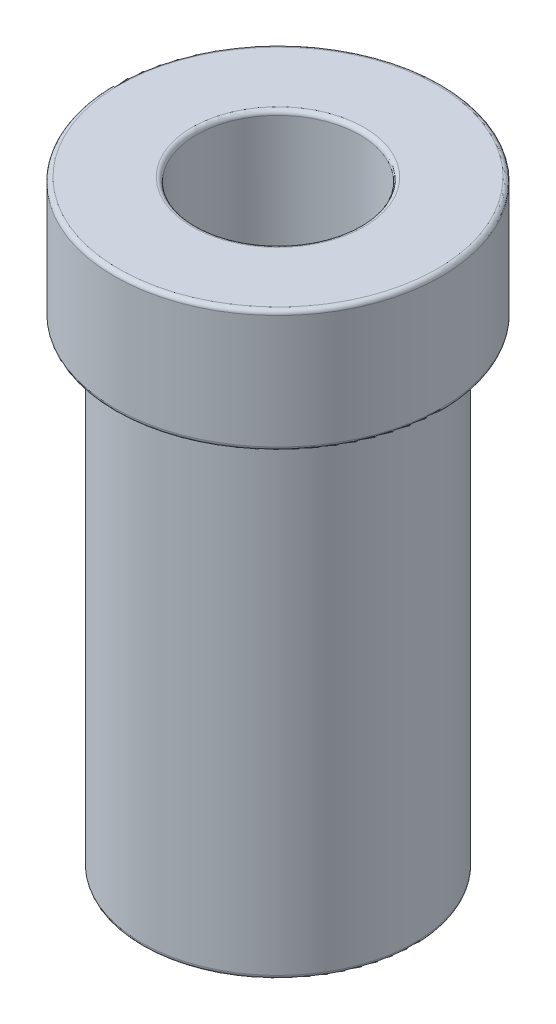
ISO-10303-21;
HEADER;
FILE_DESCRIPTION(('STEP AP214'),'2;1');
FILE_NAME('part.step','',(''),(''),'','','');
FILE_SCHEMA(('AUTOMOTIVE_DESIGN { 1 0 10303 214 1 1 1 1 }'));
ENDSEC;
DATA;
#1=APPLICATION_CONTEXT('core data for automotive mechanical design processes');
#2=APPLICATION_PROTOCOL_DEFINITION('international standard','automotive_design',2000,#1);
#3=PRODUCT_CONTEXT('',#1,'mechanical');
#4=PRODUCT('Part','Part','',(#3));
#5=PRODUCT_RELATED_PRODUCT_CATEGORY('part','',(#4));
#6=PRODUCT_DEFINITION_FORMATION('','',#4);
#7=PRODUCT_DEFINITION_CONTEXT('part definition',#1,'design');
#8=PRODUCT_DEFINITION('design','',#6,#7);
#9=PRODUCT_DEFINITION_SHAPE('','',#8);
#10=(LENGTH_UNIT() NAMED_UNIT(*) SI_UNIT(.MILLI.,.METRE.));
#11=(NAMED_UNIT(*) PLANE_ANGLE_UNIT() SI_UNIT($,.RADIAN.));
#12=(NAMED_UNIT(*) SI_UNIT($,.STERADIAN.) SOLID_ANGLE_UNIT());
#13=UNCERTAINTY_MEASURE_WITH_UNIT(LENGTH_MEASURE(1.E-05),#10,'distance_accuracy_value','');
#14=(GEOMETRIC_REPRESENTATION_CONTEXT(3) GLOBAL_UNCERTAINTY_ASSIGNED_CONTEXT((#13)) GLOBAL_UNIT_ASSIGNED_CONTEXT((#10,
#11,#12)) REPRESENTATION_CONTEXT('',''));
#15=CARTESIAN_POINT('',(0.,0.,0.));
#16=DIRECTION('',(0.,0.,1.));
#17=DIRECTION('',(1.,0.,0.));
#18=AXIS2_PLACEMENT_3D('',#15,#16,#17);
#19=CARTESIAN_POINT('',(0.,-0.6875,0.));
#20=DIRECTION('',(0.,1.,0.));
#21=DIRECTION('',(0.,0.,1.));
#22=AXIS2_PLACEMENT_3D('',#19,#20,#21);
#23=PLANE('',#22);
#24=CARTESIAN_POINT('',(0.,-0.6875,0.));
#25=DIRECTION('',(0.,1.,0.));
#26=DIRECTION('',(0.,0.,1.));
#27=AXIS2_PLACEMENT_3D('',#24,#25,#26);
#28=CIRCLE('',#27,0.15125);
#29=CARTESIAN_POINT('',(0.,-0.6875,0.15125));
#30=VERTEX_POINT('',#29);
#31=EDGE_CURVE('E61',#30,#30,#28,.F.);
#32=ORIENTED_EDGE('',*,*,#31,.T.);
#33=EDGE_LOOP('',(#32));
#34=FACE_BOUND('',#33,.T.);
#35=CARTESIAN_POINT('',(0.,-0.6875,0.));
#36=DIRECTION('',(0.,1.,0.));
#37=DIRECTION('',(0.,0.,1.));
#38=AXIS2_PLACEMENT_3D('',#35,#36,#37);
#39=CIRCLE('',#38,0.09375);
#40=CARTESIAN_POINT('',(0.,-0.6875,0.09375));
#41=VERTEX_POINT('',#40);
#42=EDGE_CURVE('E85',#41,#41,#39,.T.);
#43=ORIENTED_EDGE('',*,*,#42,.T.);
#44=EDGE_LOOP('',(#43));
#45=FACE_BOUND('',#44,.T.);
#46=ADVANCED_FACE('F37',(#34,#45),#23,.F.);
#47=CARTESIAN_POINT('',(0.,0.,0.));
#48=DIRECTION('',(0.,1.,0.));
#49=DIRECTION('',(0.,0.,1.));
#50=AXIS2_PLACEMENT_3D('',#47,#48,#49);
#51=CYLINDRICAL_SURFACE('',#50,0.15625);
#52=CARTESIAN_POINT('',(0.,-0.6825,0.));
#53=DIRECTION('',(0.,1.,0.));
#54=DIRECTION('',(0.,0.,1.));
#55=AXIS2_PLACEMENT_3D('',#52,#53,#54);
#56=CIRCLE('',#55,0.15625);
#57=CARTESIAN_POINT('',(0.,-0.6825,0.15625));
#58=VERTEX_POINT('',#57);
#59=EDGE_CURVE('E65',#58,#58,#56,.T.);
#60=ORIENTED_EDGE('',*,*,#59,.T.);
#61=EDGE_LOOP('',(#60));
#62=FACE_BOUND('',#61,.T.);
#63=CARTESIAN_POINT('',(0.,-0.145625,0.));
#64=DIRECTION('',(0.,1.,0.));
#65=DIRECTION('',(0.,0.,1.));
#66=AXIS2_PLACEMENT_3D('',#63,#64,#65);
#67=CIRCLE('',#66,0.15625);
#68=CARTESIAN_POINT('',(0.,-0.145625,0.15625));
#69=VERTEX_POINT('',#68);
#70=EDGE_CURVE('E69',#69,#69,#67,.F.);
#71=ORIENTED_EDGE('',*,*,#70,.T.);
#72=EDGE_LOOP('',(#71));
#73=FACE_BOUND('',#72,.T.);
#74=ADVANCED_FACE('F108',(#62,#73),#51,.T.);
#75=CARTESIAN_POINT('',(0.15625,-0.140625,0.));
#76=DIRECTION('',(0.,1.,0.));
#77=DIRECTION('',(0.,0.,1.));
#78=AXIS2_PLACEMENT_3D('',#75,#76,#77);
#79=PLANE('',#78);
#80=CARTESIAN_POINT('',(0.,-0.140625,0.));
#81=DIRECTION('',(0.,1.,0.));
#82=DIRECTION('',(0.,0.,1.));
#83=AXIS2_PLACEMENT_3D('',#80,#81,#82);
#84=CIRCLE('',#83,0.16125);
#85=CARTESIAN_POINT('',(0.,-0.140625,0.16125));
#86=VERTEX_POINT('',#85);
#87=EDGE_CURVE('E50',#86,#86,#84,.T.);
#88=ORIENTED_EDGE('',*,*,#87,.T.);
#89=EDGE_LOOP('',(#88));
#90=FACE_BOUND('',#89,.T.);
#91=CARTESIAN_POINT('',(0.,-0.140625,0.));
#92=DIRECTION('',(0.,1.,0.));
#93=DIRECTION('',(0.,0.,1.));
#94=AXIS2_PLACEMENT_3D('',#91,#92,#93);
#95=CIRCLE('',#94,0.1825);
#96=CARTESIAN_POINT('',(0.,-0.140625,0.1825));
#97=VERTEX_POINT('',#96);
#98=EDGE_CURVE('E55',#97,#97,#95,.F.);
#99=ORIENTED_EDGE('',*,*,#98,.T.);
#100=EDGE_LOOP('',(#99));
#101=FACE_BOUND('',#100,.T.);
#102=ADVANCED_FACE('F114',(#90,#101),#79,.F.);
#103=CARTESIAN_POINT('',(0.,0.,0.));
#104=DIRECTION('',(0.,1.,0.));
#105=DIRECTION('',(0.,0.,1.));
#106=AXIS2_PLACEMENT_3D('',#103,#104,#105);
#107=CYLINDRICAL_SURFACE('',#106,0.1875);
#108=CARTESIAN_POINT('',(0.,-0.135625,0.));
#109=DIRECTION('',(0.,1.,0.));
#110=DIRECTION('',(0.,0.,1.));
#111=AXIS2_PLACEMENT_3D('',#108,#109,#110);
#112=CIRCLE('',#111,0.1875);
#113=CARTESIAN_POINT('',(0.,-0.135625,0.1875));
#114=VERTEX_POINT('',#113);
#115=EDGE_CURVE('E10',#114,#114,#112,.T.);
#116=ORIENTED_EDGE('',*,*,#115,.T.);
#117=EDGE_LOOP('',(#116));
#118=FACE_BOUND('',#117,.T.);
#119=CARTESIAN_POINT('',(0.,-0.00500000000000001,0.));
#120=DIRECTION('',(0.,-1.,0.));
#121=DIRECTION('',(0.,0.,-1.));
#122=AXIS2_PLACEMENT_3D('',#119,#120,#121);
#123=CIRCLE('',#122,0.1875);
#124=CARTESIAN_POINT('',(0.,-0.00500000000000001,-0.1875));
#125=VERTEX_POINT('',#124);
#126=EDGE_CURVE('E45',#125,#125,#123,.T.);
#127=ORIENTED_EDGE('',*,*,#126,.T.);
#128=EDGE_LOOP('',(#127));
#129=FACE_BOUND('',#128,.T.);
#130=ADVANCED_FACE('F104',(#118,#129),#107,.T.);
#131=CARTESIAN_POINT('',(0.1875,0.,0.));
#132=DIRECTION('',(0.,-1.,0.));
#133=DIRECTION('',(0.,0.,-1.));
#134=AXIS2_PLACEMENT_3D('',#131,#132,#133);
#135=PLANE('',#134);
#136=CARTESIAN_POINT('',(0.,0.,0.));
#137=DIRECTION('',(0.,-1.,0.));
#138=DIRECTION('',(0.,0.,-1.));
#139=AXIS2_PLACEMENT_3D('',#136,#137,#138);
#140=CIRCLE('',#139,0.09875);
#141=CARTESIAN_POINT('',(0.,0.,-0.09875));
#142=VERTEX_POINT('',#141);
#143=EDGE_CURVE('E73',#142,#142,#140,.T.);
#144=ORIENTED_EDGE('',*,*,#143,.T.);
#145=EDGE_LOOP('',(#144));
#146=FACE_BOUND('',#145,.T.);
#147=CARTESIAN_POINT('',(0.,0.,0.));
#148=DIRECTION('',(0.,-1.,0.));
#149=DIRECTION('',(0.,0.,-1.));
#150=AXIS2_PLACEMENT_3D('',#147,#148,#149);
#151=CIRCLE('',#150,0.1825);
#152=CARTESIAN_POINT('',(0.,0.,-0.1825));
#153=VERTEX_POINT('',#152);
#154=EDGE_CURVE('E77',#153,#153,#151,.F.);
#155=ORIENTED_EDGE('',*,*,#154,.T.);
#156=EDGE_LOOP('',(#155));
#157=FACE_BOUND('',#156,.T.);
#158=ADVANCED_FACE('F94',(#146,#157),#135,.F.);
#159=CARTESIAN_POINT('',(0.,-0.6875,0.));
#160=DIRECTION('',(0.,1.,0.));
#161=DIRECTION('',(0.,0.,1.));
#162=AXIS2_PLACEMENT_3D('',#159,#160,#161);
#163=CYLINDRICAL_SURFACE('',#162,0.09375);
#164=CARTESIAN_POINT('',(0.,-0.00500000000000001,0.));
#165=DIRECTION('',(0.,-1.,0.));
#166=DIRECTION('',(0.,0.,-1.));
#167=AXIS2_PLACEMENT_3D('',#164,#165,#166);
#168=CIRCLE('',#167,0.09375);
#169=CARTESIAN_POINT('',(0.,-0.00500000000000001,-0.09375));
#170=VERTEX_POINT('',#169);
#171=EDGE_CURVE('E81',#170,#170,#168,.F.);
#172=ORIENTED_EDGE('',*,*,#171,.T.);
#173=EDGE_LOOP('',(#172));
#174=FACE_BOUND('',#173,.T.);
#175=ORIENTED_EDGE('',*,*,#42,.F.);
#176=EDGE_LOOP('',(#175));
#177=FACE_BOUND('',#176,.T.);
#178=ADVANCED_FACE('F91',(#174,#177),#163,.F.);
#179=CARTESIAN_POINT('',(0.,-0.00500000000000001,0.));
#180=DIRECTION('',(0.,-1.,0.));
#181=DIRECTION('',(0.,0.,-1.));
#182=AXIS2_PLACEMENT_3D('',#179,#180,#181);
#183=TOROIDAL_SURFACE('',#182,0.09875,0.005);
#184=ORIENTED_EDGE('',*,*,#143,.F.);
#185=EDGE_LOOP('',(#184));
#186=FACE_BOUND('',#185,.T.);
#187=ORIENTED_EDGE('',*,*,#171,.F.);
#188=EDGE_LOOP('',(#187));
#189=FACE_BOUND('',#188,.T.);
#190=ADVANCED_FACE('F93',(#186,#189),#183,.T.);
#191=CARTESIAN_POINT('',(0.,-0.6825,0.));
#192=DIRECTION('',(0.,1.,0.));
#193=DIRECTION('',(0.,0.,1.));
#194=AXIS2_PLACEMENT_3D('',#191,#192,#193);
#195=TOROIDAL_SURFACE('',#194,0.15125,0.005);
#196=ORIENTED_EDGE('',*,*,#31,.F.);
#197=EDGE_LOOP('',(#196));
#198=FACE_BOUND('',#197,.T.);
#199=ORIENTED_EDGE('',*,*,#59,.F.);
#200=EDGE_LOOP('',(#199));
#201=FACE_BOUND('',#200,.T.);
#202=ADVANCED_FACE('F101',(#198,#201),#195,.T.);
#203=CARTESIAN_POINT('',(0.,-0.145625,0.));
#204=DIRECTION('',(0.,1.,0.));
#205=DIRECTION('',(0.,0.,1.));
#206=AXIS2_PLACEMENT_3D('',#203,#204,#205);
#207=TOROIDAL_SURFACE('',#206,0.16125,0.005);
#208=ORIENTED_EDGE('',*,*,#70,.F.);
#209=EDGE_LOOP('',(#208));
#210=FACE_BOUND('',#209,.T.);
#211=ORIENTED_EDGE('',*,*,#87,.F.);
#212=EDGE_LOOP('',(#211));
#213=FACE_BOUND('',#212,.T.);
#214=ADVANCED_FACE('F121',(#210,#213),#207,.F.);
#215=CARTESIAN_POINT('',(0.,-0.135625,0.));
#216=DIRECTION('',(0.,1.,0.));
#217=DIRECTION('',(0.,0.,1.));
#218=AXIS2_PLACEMENT_3D('',#215,#216,#217);
#219=TOROIDAL_SURFACE('',#218,0.1825,0.005);
#220=ORIENTED_EDGE('',*,*,#98,.F.);
#221=EDGE_LOOP('',(#220));
#222=FACE_BOUND('',#221,.T.);
#223=ORIENTED_EDGE('',*,*,#115,.F.);
#224=EDGE_LOOP('',(#223));
#225=FACE_BOUND('',#224,.T.);
#226=ADVANCED_FACE('F124',(#222,#225),#219,.T.);
#227=CARTESIAN_POINT('',(0.,-0.00500000000000001,0.));
#228=DIRECTION('',(0.,-1.,0.));
#229=DIRECTION('',(0.,0.,-1.));
#230=AXIS2_PLACEMENT_3D('',#227,#228,#229);
#231=TOROIDAL_SURFACE('',#230,0.1825,0.005);
#232=ORIENTED_EDGE('',*,*,#126,.F.);
#233=EDGE_LOOP('',(#232));
#234=FACE_BOUND('',#233,.T.);
#235=ORIENTED_EDGE('',*,*,#154,.F.);
#236=EDGE_LOOP('',(#235));
#237=FACE_BOUND('',#236,.T.);
#238=ADVANCED_FACE('F39',(#234,#237),#231,.T.);
#239=CLOSED_SHELL('',(#46,#74,#102,#130,#158,#178,#190,#202,#214,#226,#238));
#240=MANIFOLD_SOLID_BREP('B2',#239);
#241=ADVANCED_BREP_SHAPE_REPRESENTATION('',(#18,#240),#14);
#242=SHAPE_DEFINITION_REPRESENTATION(#9,#241);
ENDSEC;
END-ISO-10303-21;
